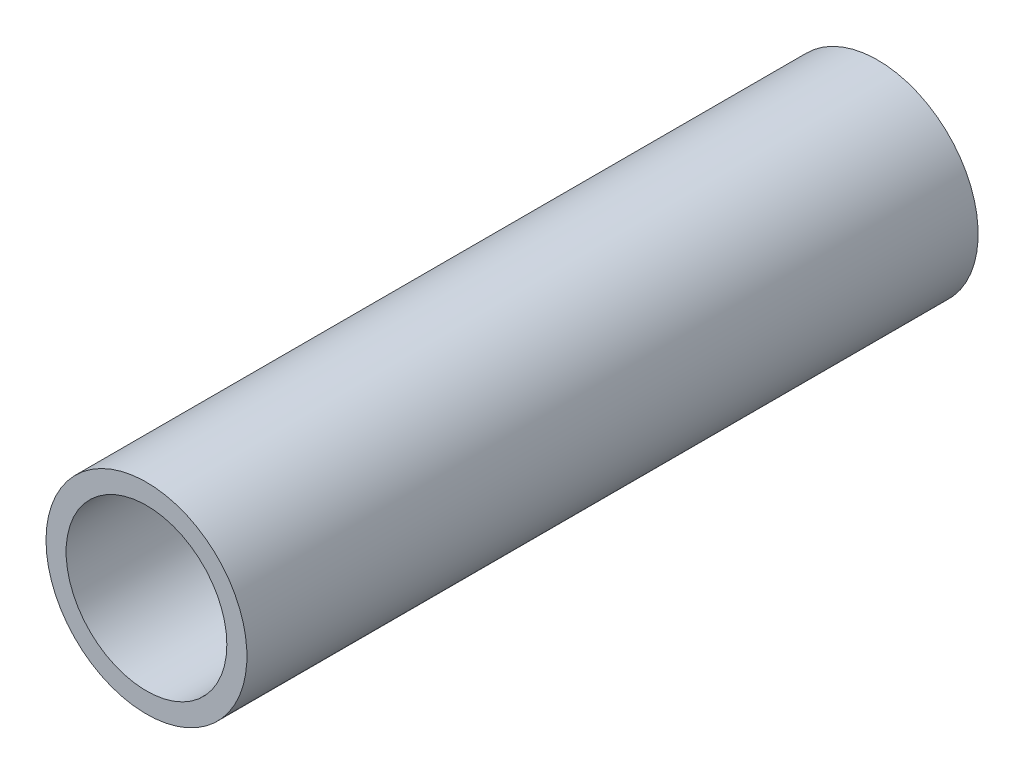
ISO-10303-21;
HEADER;
FILE_DESCRIPTION(('STEP AP214'),'2;1');
FILE_NAME('part.step','',(''),(''),'','','');
FILE_SCHEMA(('AUTOMOTIVE_DESIGN { 1 0 10303 214 1 1 1 1 }'));
ENDSEC;
DATA;
#1=APPLICATION_CONTEXT('core data for automotive mechanical design processes');
#2=APPLICATION_PROTOCOL_DEFINITION('international standard','automotive_design',2000,#1);
#3=PRODUCT_CONTEXT('',#1,'mechanical');
#4=PRODUCT('Part','Part','',(#3));
#5=PRODUCT_RELATED_PRODUCT_CATEGORY('part','',(#4));
#6=PRODUCT_DEFINITION_FORMATION('','',#4);
#7=PRODUCT_DEFINITION_CONTEXT('part definition',#1,'design');
#8=PRODUCT_DEFINITION('design','',#6,#7);
#9=PRODUCT_DEFINITION_SHAPE('','',#8);
#10=(LENGTH_UNIT() NAMED_UNIT(*) SI_UNIT(.MILLI.,.METRE.));
#11=(NAMED_UNIT(*) PLANE_ANGLE_UNIT() SI_UNIT($,.RADIAN.));
#12=(NAMED_UNIT(*) SI_UNIT($,.STERADIAN.) SOLID_ANGLE_UNIT());
#13=UNCERTAINTY_MEASURE_WITH_UNIT(LENGTH_MEASURE(1.E-05),#10,'distance_accuracy_value','');
#14=(GEOMETRIC_REPRESENTATION_CONTEXT(3) GLOBAL_UNCERTAINTY_ASSIGNED_CONTEXT((#13)) GLOBAL_UNIT_ASSIGNED_CONTEXT((#10,
#11,#12)) REPRESENTATION_CONTEXT('',''));
#15=CARTESIAN_POINT('',(0.,0.,0.));
#16=DIRECTION('',(0.,0.,1.));
#17=DIRECTION('',(1.,0.,0.));
#18=AXIS2_PLACEMENT_3D('',#15,#16,#17);
#19=CARTESIAN_POINT('',(0.,0.,149.34));
#20=DIRECTION('',(0.,0.,1.));
#21=DIRECTION('',(1.,0.,0.));
#22=AXIS2_PLACEMENT_3D('',#19,#20,#21);
#23=PLANE('',#22);
#24=CARTESIAN_POINT('',(0.,0.,149.34));
#25=DIRECTION('',(0.,0.,1.));
#26=DIRECTION('',(1.,0.,0.));
#27=AXIS2_PLACEMENT_3D('',#24,#25,#26);
#28=CIRCLE('',#27,30.);
#29=CARTESIAN_POINT('',(30.,0.,149.34));
#30=VERTEX_POINT('',#29);
#31=EDGE_CURVE('E48',#30,#30,#28,.T.);
#32=ORIENTED_EDGE('',*,*,#31,.F.);
#33=EDGE_LOOP('',(#32));
#34=FACE_BOUND('',#33,.T.);
#35=CARTESIAN_POINT('',(0.,0.,149.34));
#36=DIRECTION('',(0.,0.,-1.));
#37=DIRECTION('',(-1.,0.,0.));
#38=AXIS2_PLACEMENT_3D('',#35,#36,#37);
#39=CIRCLE('',#38,37.5);
#40=CARTESIAN_POINT('',(-37.5,0.,149.34));
#41=VERTEX_POINT('',#40);
#42=EDGE_CURVE('E39',#41,#41,#39,.T.);
#43=ORIENTED_EDGE('',*,*,#42,.F.);
#44=EDGE_LOOP('',(#43));
#45=FACE_BOUND('',#44,.T.);
#46=ADVANCED_FACE('F36',(#34,#45),#23,.T.);
#47=CARTESIAN_POINT('',(0.,37.5000000000001,-123.59));
#48=DIRECTION('',(0.,0.,-1.));
#49=DIRECTION('',(-1.,0.,0.));
#50=AXIS2_PLACEMENT_3D('',#47,#48,#49);
#51=PLANE('',#50);
#52=CARTESIAN_POINT('',(0.,0.,-123.59));
#53=DIRECTION('',(0.,0.,1.));
#54=DIRECTION('',(1.,0.,0.));
#55=AXIS2_PLACEMENT_3D('',#52,#53,#54);
#56=CIRCLE('',#55,30.);
#57=CARTESIAN_POINT('',(30.,0.,-123.59));
#58=VERTEX_POINT('',#57);
#59=EDGE_CURVE('E46',#58,#58,#56,.T.);
#60=ORIENTED_EDGE('',*,*,#59,.T.);
#61=EDGE_LOOP('',(#60));
#62=FACE_BOUND('',#61,.T.);
#63=CARTESIAN_POINT('',(0.,1.11022302462516E-13,-123.59));
#64=DIRECTION('',(0.,0.,-1.));
#65=DIRECTION('',(-1.,0.,0.));
#66=AXIS2_PLACEMENT_3D('',#63,#64,#65);
#67=CIRCLE('',#66,37.5);
#68=CARTESIAN_POINT('',(-37.5,0.,-123.59));
#69=VERTEX_POINT('',#68);
#70=EDGE_CURVE('E10',#69,#69,#67,.F.);
#71=ORIENTED_EDGE('',*,*,#70,.F.);
#72=EDGE_LOOP('',(#71));
#73=FACE_BOUND('',#72,.T.);
#74=ADVANCED_FACE('F54',(#62,#73),#51,.T.);
#75=CARTESIAN_POINT('',(0.,0.,148.59));
#76=DIRECTION('',(0.,0.,-1.));
#77=DIRECTION('',(-1.,0.,0.));
#78=AXIS2_PLACEMENT_3D('',#75,#76,#77);
#79=CYLINDRICAL_SURFACE('',#78,37.5);
#80=CARTESIAN_POINT('',(-37.5,0.,-123.59));
#81=CARTESIAN_POINT('',(-37.5,0.,-120.746979166667));
#82=CARTESIAN_POINT('',(-37.5,0.,-117.903958333333));
#83=CARTESIAN_POINT('',(-37.5,0.,-112.217916666667));
#84=CARTESIAN_POINT('',(-37.5,0.,-109.374895833333));
#85=CARTESIAN_POINT('',(-37.5,0.,-103.688854166667));
#86=CARTESIAN_POINT('',(-37.5,0.,-100.845833333333));
#87=CARTESIAN_POINT('',(-37.5,0.,-95.1597916666666));
#88=CARTESIAN_POINT('',(-37.5,0.,-92.3167708333333));
#89=CARTESIAN_POINT('',(-37.5,0.,-86.6307291666666));
#90=CARTESIAN_POINT('',(-37.5,0.,-83.7877083333333));
#91=CARTESIAN_POINT('',(-37.5,0.,-78.1016666666666));
#92=CARTESIAN_POINT('',(-37.5,0.,-75.2586458333333));
#93=CARTESIAN_POINT('',(-37.5,0.,-69.5726041666666));
#94=CARTESIAN_POINT('',(-37.5,0.,-66.7295833333333));
#95=CARTESIAN_POINT('',(-37.5,0.,-61.0435416666666));
#96=CARTESIAN_POINT('',(-37.5,0.,-58.2005208333333));
#97=CARTESIAN_POINT('',(-37.5,0.,-52.5144791666666));
#98=CARTESIAN_POINT('',(-37.5,0.,-49.6714583333333));
#99=CARTESIAN_POINT('',(-37.5,0.,-43.9854166666667));
#100=CARTESIAN_POINT('',(-37.5,0.,-41.1423958333333));
#101=CARTESIAN_POINT('',(-37.5,0.,-35.4563541666667));
#102=CARTESIAN_POINT('',(-37.5,0.,-32.6133333333333));
#103=CARTESIAN_POINT('',(-37.5,0.,-26.9272916666667));
#104=CARTESIAN_POINT('',(-37.5,0.,-24.0842708333333));
#105=CARTESIAN_POINT('',(-37.5,0.,-18.3982291666667));
#106=CARTESIAN_POINT('',(-37.5,0.,-15.5552083333333));
#107=CARTESIAN_POINT('',(-37.5,0.,-9.86916666666668));
#108=CARTESIAN_POINT('',(-37.5,0.,-7.02614583333336));
#109=CARTESIAN_POINT('',(-37.5,0.,-1.3401041666667));
#110=CARTESIAN_POINT('',(-37.5,0.,1.50291666666664));
#111=CARTESIAN_POINT('',(-37.5,0.,7.18895833333331));
#112=CARTESIAN_POINT('',(-37.5,0.,10.0319791666666));
#113=CARTESIAN_POINT('',(-37.5,0.,15.7180208333333));
#114=CARTESIAN_POINT('',(-37.5,0.,18.5610416666666));
#115=CARTESIAN_POINT('',(-37.5,0.,24.2470833333333));
#116=CARTESIAN_POINT('',(-37.5,0.,27.0901041666666));
#117=CARTESIAN_POINT('',(-37.5,0.,32.7761458333333));
#118=CARTESIAN_POINT('',(-37.5,0.,35.6191666666666));
#119=CARTESIAN_POINT('',(-37.5,0.,41.3052083333333));
#120=CARTESIAN_POINT('',(-37.5,0.,44.1482291666666));
#121=CARTESIAN_POINT('',(-37.5,0.,49.8342708333333));
#122=CARTESIAN_POINT('',(-37.5,0.,52.6772916666666));
#123=CARTESIAN_POINT('',(-37.5,0.,58.3633333333333));
#124=CARTESIAN_POINT('',(-37.5,0.,61.2063541666666));
#125=CARTESIAN_POINT('',(-37.5,0.,66.8923958333333));
#126=CARTESIAN_POINT('',(-37.5,0.,69.7354166666666));
#127=CARTESIAN_POINT('',(-37.5,0.,75.4214583333332));
#128=CARTESIAN_POINT('',(-37.5,0.,78.2644791666666));
#129=CARTESIAN_POINT('',(-37.5,0.,83.9505208333332));
#130=CARTESIAN_POINT('',(-37.5,0.,86.7935416666666));
#131=CARTESIAN_POINT('',(-37.5,0.,92.4795833333333));
#132=CARTESIAN_POINT('',(-37.5,0.,95.3226041666666));
#133=CARTESIAN_POINT('',(-37.5,0.,101.008645833333));
#134=CARTESIAN_POINT('',(-37.5,0.,103.851666666667));
#135=CARTESIAN_POINT('',(-37.5,0.,109.537708333333));
#136=CARTESIAN_POINT('',(-37.5,0.,112.380729166667));
#137=CARTESIAN_POINT('',(-37.5,0.,118.066770833333));
#138=CARTESIAN_POINT('',(-37.5,0.,120.909791666667));
#139=CARTESIAN_POINT('',(-37.5,0.,126.595833333333));
#140=CARTESIAN_POINT('',(-37.5,0.,129.438854166667));
#141=CARTESIAN_POINT('',(-37.5,0.,135.124895833333));
#142=CARTESIAN_POINT('',(-37.5,0.,137.967916666667));
#143=CARTESIAN_POINT('',(-37.5,0.,143.653958333333));
#144=CARTESIAN_POINT('',(-37.5,0.,146.496979166667));
#145=CARTESIAN_POINT('',(-37.5,0.,149.34));
#146=B_SPLINE_CURVE_WITH_KNOTS('',3,(#80,#81,#82,#83,#84,#85,#86,#87,#88,#89,#90,#91,#92,#93,
#94,#95,#96,#97,#98,#99,#100,#101,#102,#103,#104,#105,#106,#107,#108,#109,#110,#111,#112,#113,
#114,#115,#116,#117,#118,#119,#120,#121,#122,#123,#124,#125,#126,#127,#128,#129,#130,#131,#132,
#133,#134,#135,#136,#137,#138,#139,#140,#141,#142,#143,#144,#145),.UNSPECIFIED.,.F.,.F.,(4,2,2,
2,2,2,2,2,2,2,2,2,2,2,2,2,2,2,2,2,2,2,2,2,2,2,2,2,2,2,2,2,4),(0.,8.52906250000002,17.058125,
25.5871875,34.11625,42.6453125,51.174375,59.7034375,68.2325,76.7615624999999,85.2906249999999,
93.8196874999999,102.34875,110.8778125,119.406875,127.9359375,136.465,144.9940625,153.523125,
162.0521875,170.58125,179.1103125,187.639375,196.1684375,204.6975,213.2265625,221.755625,
230.2846875,238.81375,247.3428125,255.871875,264.4009375,272.93),.UNSPECIFIED.);
#147=EDGE_CURVE('BSEAM60',#69,#41,#146,.T.);
#148=ORIENTED_EDGE('',*,*,#70,.T.);
#149=ORIENTED_EDGE('',*,*,#42,.T.);
#150=ORIENTED_EDGE('',*,*,#147,.T.);
#151=ORIENTED_EDGE('',*,*,#147,.F.);
#152=EDGE_LOOP('',(#148,#150,#149,#151));
#153=FACE_BOUND('',#152,.T.);
#154=ADVANCED_FACE('F60',(#153),#79,.T.);
#155=CARTESIAN_POINT('',(0.,0.,-123.59));
#156=DIRECTION('',(0.,0.,1.));
#157=DIRECTION('',(1.,0.,0.));
#158=AXIS2_PLACEMENT_3D('',#155,#156,#157);
#159=CYLINDRICAL_SURFACE('',#158,30.);
#160=ORIENTED_EDGE('',*,*,#59,.F.);
#161=EDGE_LOOP('',(#160));
#162=FACE_BOUND('',#161,.T.);
#163=ORIENTED_EDGE('',*,*,#31,.T.);
#164=EDGE_LOOP('',(#163));
#165=FACE_BOUND('',#164,.T.);
#166=ADVANCED_FACE('F57',(#162,#165),#159,.F.);
#167=CLOSED_SHELL('',(#46,#74,#154,#166));
#168=MANIFOLD_SOLID_BREP('B2',#167);
#169=ADVANCED_BREP_SHAPE_REPRESENTATION('',(#18,#168),#14);
#170=SHAPE_DEFINITION_REPRESENTATION(#9,#169);
ENDSEC;
END-ISO-10303-21;
